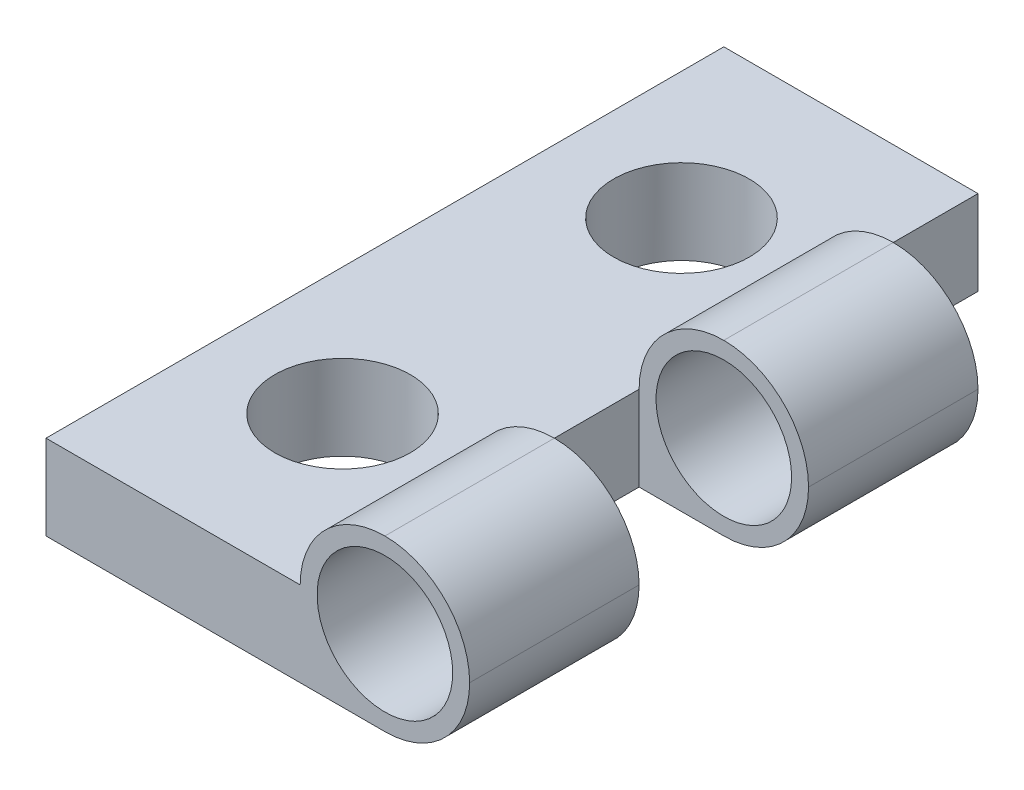
ISO-10303-21;
HEADER;
FILE_DESCRIPTION(('STEP AP214'),'2;1');
FILE_NAME('part.step','',(''),(''),'','','');
FILE_SCHEMA(('AUTOMOTIVE_DESIGN { 1 0 10303 214 1 1 1 1 }'));
ENDSEC;
DATA;
#1=APPLICATION_CONTEXT('core data for automotive mechanical design processes');
#2=APPLICATION_PROTOCOL_DEFINITION('international standard','automotive_design',2000,#1);
#3=PRODUCT_CONTEXT('',#1,'mechanical');
#4=PRODUCT('Part','Part','',(#3));
#5=PRODUCT_RELATED_PRODUCT_CATEGORY('part','',(#4));
#6=PRODUCT_DEFINITION_FORMATION('','',#4);
#7=PRODUCT_DEFINITION_CONTEXT('part definition',#1,'design');
#8=PRODUCT_DEFINITION('design','',#6,#7);
#9=PRODUCT_DEFINITION_SHAPE('','',#8);
#10=(LENGTH_UNIT() NAMED_UNIT(*) SI_UNIT(.MILLI.,.METRE.));
#11=(NAMED_UNIT(*) PLANE_ANGLE_UNIT() SI_UNIT($,.RADIAN.));
#12=(NAMED_UNIT(*) SI_UNIT($,.STERADIAN.) SOLID_ANGLE_UNIT());
#13=UNCERTAINTY_MEASURE_WITH_UNIT(LENGTH_MEASURE(1.E-05),#10,'distance_accuracy_value','');
#14=(GEOMETRIC_REPRESENTATION_CONTEXT(3) GLOBAL_UNCERTAINTY_ASSIGNED_CONTEXT((#13)) GLOBAL_UNIT_ASSIGNED_CONTEXT((#10,
#11,#12)) REPRESENTATION_CONTEXT('',''));
#15=CARTESIAN_POINT('',(0.,0.,0.));
#16=DIRECTION('',(0.,0.,1.));
#17=DIRECTION('',(1.,0.,0.));
#18=AXIS2_PLACEMENT_3D('',#15,#16,#17);
#19=CARTESIAN_POINT('',(7.5,5.,20.));
#20=DIRECTION('',(-1.,0.,0.));
#21=DIRECTION('',(0.,0.,1.));
#22=AXIS2_PLACEMENT_3D('',#19,#20,#21);
#23=PLANE('',#22);
#24=DIRECTION('',(0.,-1.,0.));
#25=VECTOR('',#24,1.);
#26=CARTESIAN_POINT('',(7.5,0.,0.));
#27=LINE('',#26,#25);
#28=CARTESIAN_POINT('',(7.5,5.,0.));
#29=VERTEX_POINT('',#28);
#30=CARTESIAN_POINT('',(7.5,0.,0.));
#31=VERTEX_POINT('',#30);
#32=EDGE_CURVE('E157',#29,#31,#27,.T.);
#33=ORIENTED_EDGE('',*,*,#32,.F.);
#34=DIRECTION('',(0.,0.,-1.));
#35=VECTOR('',#34,1.);
#36=CARTESIAN_POINT('',(7.5,5.,20.));
#37=LINE('',#36,#35);
#38=CARTESIAN_POINT('',(7.5,5.,10.));
#39=VERTEX_POINT('',#38);
#40=EDGE_CURVE('E181',#39,#29,#37,.T.);
#41=ORIENTED_EDGE('',*,*,#40,.F.);
#42=DIRECTION('',(0.,1.,0.));
#43=VECTOR('',#42,1.);
#44=CARTESIAN_POINT('',(7.5,0.,10.));
#45=LINE('',#44,#43);
#46=CARTESIAN_POINT('',(7.5,0.,10.));
#47=VERTEX_POINT('',#46);
#48=EDGE_CURVE('E170',#47,#39,#45,.T.);
#49=ORIENTED_EDGE('',*,*,#48,.F.);
#50=DIRECTION('',(0.,0.,-1.));
#51=VECTOR('',#50,1.);
#52=CARTESIAN_POINT('',(7.5,0.,20.));
#53=LINE('',#52,#51);
#54=EDGE_CURVE('E149',#47,#31,#53,.T.);
#55=ORIENTED_EDGE('',*,*,#54,.T.);
#56=EDGE_LOOP('',(#33,#41,#49,#55));
#57=FACE_BOUND('',#56,.T.);
#58=ADVANCED_FACE('F39',(#57),#23,.F.);
#59=DIRECTION('',(0.,1.,0.));
#60=VECTOR('',#59,1.);
#61=CARTESIAN_POINT('',(7.5,0.,-10.));
#62=LINE('',#61,#60);
#63=CARTESIAN_POINT('',(7.5,0.,-10.));
#64=VERTEX_POINT('',#63);
#65=CARTESIAN_POINT('',(7.5,5.,-10.));
#66=VERTEX_POINT('',#65);
#67=EDGE_CURVE('E133',#64,#66,#62,.T.);
#68=ORIENTED_EDGE('',*,*,#67,.F.);
#69=CARTESIAN_POINT('',(7.5,0.,-20.));
#70=VERTEX_POINT('',#69);
#71=EDGE_CURVE('E140',#64,#70,#53,.T.);
#72=ORIENTED_EDGE('',*,*,#71,.T.);
#73=DIRECTION('',(0.,-1.,0.));
#74=VECTOR('',#73,1.);
#75=CARTESIAN_POINT('',(7.5,5.,-20.));
#76=LINE('',#75,#74);
#77=CARTESIAN_POINT('',(7.5,5.,-20.));
#78=VERTEX_POINT('',#77);
#79=EDGE_CURVE('E210',#78,#70,#76,.T.);
#80=ORIENTED_EDGE('',*,*,#79,.F.);
#81=EDGE_CURVE('E154',#66,#78,#37,.T.);
#82=ORIENTED_EDGE('',*,*,#81,.F.);
#83=EDGE_LOOP('',(#68,#72,#80,#82));
#84=FACE_BOUND('',#83,.T.);
#85=ADVANCED_FACE('F153',(#84),#23,.F.);
#86=CARTESIAN_POINT('',(-7.5,5.,-20.));
#87=DIRECTION('',(0.,0.,1.));
#88=DIRECTION('',(1.,0.,0.));
#89=AXIS2_PLACEMENT_3D('',#86,#87,#88);
#90=PLANE('',#89);
#91=DIRECTION('',(-1.,0.,0.));
#92=VECTOR('',#91,1.);
#93=CARTESIAN_POINT('',(-7.5,0.,-20.));
#94=LINE('',#93,#92);
#95=CARTESIAN_POINT('',(-7.5,0.,-20.));
#96=VERTEX_POINT('',#95);
#97=EDGE_CURVE('E144',#70,#96,#94,.T.);
#98=ORIENTED_EDGE('',*,*,#97,.T.);
#99=DIRECTION('',(0.,-1.,0.));
#100=VECTOR('',#99,1.);
#101=CARTESIAN_POINT('',(-7.5,5.,-20.));
#102=LINE('',#101,#100);
#103=CARTESIAN_POINT('',(-7.5,5.,-20.));
#104=VERTEX_POINT('',#103);
#105=EDGE_CURVE('E206',#104,#96,#102,.T.);
#106=ORIENTED_EDGE('',*,*,#105,.F.);
#107=DIRECTION('',(-1.,0.,0.));
#108=VECTOR('',#107,1.);
#109=CARTESIAN_POINT('',(-7.5,5.,-20.));
#110=LINE('',#109,#108);
#111=EDGE_CURVE('E180',#78,#104,#110,.T.);
#112=ORIENTED_EDGE('',*,*,#111,.F.);
#113=ORIENTED_EDGE('',*,*,#79,.T.);
#114=EDGE_LOOP('',(#98,#106,#112,#113));
#115=FACE_BOUND('',#114,.T.);
#116=ADVANCED_FACE('F322',(#115),#90,.F.);
#117=CARTESIAN_POINT('',(-7.5,5.,20.));
#118=DIRECTION('',(1.,0.,0.));
#119=DIRECTION('',(0.,0.,-1.));
#120=AXIS2_PLACEMENT_3D('',#117,#118,#119);
#121=PLANE('',#120);
#122=DIRECTION('',(0.,0.,1.));
#123=VECTOR('',#122,1.);
#124=CARTESIAN_POINT('',(-7.5,0.,20.));
#125=LINE('',#124,#123);
#126=CARTESIAN_POINT('',(-7.5,0.,20.));
#127=VERTEX_POINT('',#126);
#128=EDGE_CURVE('E196',#96,#127,#125,.T.);
#129=ORIENTED_EDGE('',*,*,#128,.T.);
#130=DIRECTION('',(0.,-1.,0.));
#131=VECTOR('',#130,1.);
#132=CARTESIAN_POINT('',(-7.5,5.,20.));
#133=LINE('',#132,#131);
#134=CARTESIAN_POINT('',(-7.5,5.,20.));
#135=VERTEX_POINT('',#134);
#136=EDGE_CURVE('E190',#135,#127,#133,.T.);
#137=ORIENTED_EDGE('',*,*,#136,.F.);
#138=DIRECTION('',(0.,0.,1.));
#139=VECTOR('',#138,1.);
#140=CARTESIAN_POINT('',(-7.5,5.,20.));
#141=LINE('',#140,#139);
#142=EDGE_CURVE('E184',#104,#135,#141,.T.);
#143=ORIENTED_EDGE('',*,*,#142,.F.);
#144=ORIENTED_EDGE('',*,*,#105,.T.);
#145=EDGE_LOOP('',(#129,#137,#143,#144));
#146=FACE_BOUND('',#145,.T.);
#147=ADVANCED_FACE('F369',(#146),#121,.F.);
#148=CARTESIAN_POINT('',(-7.5,5.,20.));
#149=DIRECTION('',(0.,0.,-1.));
#150=DIRECTION('',(-1.,0.,0.));
#151=AXIS2_PLACEMENT_3D('',#148,#149,#150);
#152=PLANE('',#151);
#153=CARTESIAN_POINT('',(12.5,5.,20.));
#154=DIRECTION('',(0.,0.,1.));
#155=DIRECTION('',(1.,0.,0.));
#156=AXIS2_PLACEMENT_3D('',#153,#154,#155);
#157=CIRCLE('',#156,4.);
#158=CARTESIAN_POINT('',(16.5,5.,20.));
#159=VERTEX_POINT('',#158);
#160=EDGE_CURVE('E258',#159,#159,#157,.T.);
#161=ORIENTED_EDGE('',*,*,#160,.F.);
#162=EDGE_LOOP('',(#161));
#163=FACE_BOUND('',#162,.T.);
#164=CARTESIAN_POINT('',(12.5,5.,20.));
#165=DIRECTION('',(0.,0.,-1.));
#166=DIRECTION('',(-1.,0.,0.));
#167=AXIS2_PLACEMENT_3D('',#164,#165,#166);
#168=CIRCLE('',#167,5.);
#169=CARTESIAN_POINT('',(17.5,5.,20.));
#170=VERTEX_POINT('',#169);
#171=CARTESIAN_POINT('',(12.5,10.,20.));
#172=VERTEX_POINT('',#171);
#173=EDGE_CURVE('E213',#170,#172,#168,.F.);
#174=ORIENTED_EDGE('',*,*,#173,.T.);
#175=CARTESIAN_POINT('',(12.5,5.,20.));
#176=DIRECTION('',(0.,0.,-1.));
#177=DIRECTION('',(-1.,0.,0.));
#178=AXIS2_PLACEMENT_3D('',#175,#176,#177);
#179=CIRCLE('',#178,5.);
#180=CARTESIAN_POINT('',(7.5,5.,20.));
#181=VERTEX_POINT('',#180);
#182=EDGE_CURVE('E219',#172,#181,#179,.F.);
#183=ORIENTED_EDGE('',*,*,#182,.T.);
#184=DIRECTION('',(1.,0.,0.));
#185=VECTOR('',#184,1.);
#186=CARTESIAN_POINT('',(-7.5,5.,20.));
#187=LINE('',#186,#185);
#188=EDGE_CURVE('E187',#135,#181,#187,.T.);
#189=ORIENTED_EDGE('',*,*,#188,.F.);
#190=ORIENTED_EDGE('',*,*,#136,.T.);
#191=DIRECTION('',(1.,0.,0.));
#192=VECTOR('',#191,1.);
#193=CARTESIAN_POINT('',(-7.5,0.,20.));
#194=LINE('',#193,#192);
#195=CARTESIAN_POINT('',(12.5,0.,20.));
#196=VERTEX_POINT('',#195);
#197=EDGE_CURVE('E199',#127,#196,#194,.T.);
#198=ORIENTED_EDGE('',*,*,#197,.T.);
#199=CARTESIAN_POINT('',(12.5,5.,20.));
#200=DIRECTION('',(0.,0.,-1.));
#201=DIRECTION('',(-1.,0.,0.));
#202=AXIS2_PLACEMENT_3D('',#199,#200,#201);
#203=CIRCLE('',#202,5.);
#204=EDGE_CURVE('E216',#196,#170,#203,.F.);
#205=ORIENTED_EDGE('',*,*,#204,.T.);
#206=EDGE_LOOP('',(#174,#183,#189,#190,#198,#205));
#207=FACE_BOUND('',#206,.T.);
#208=ADVANCED_FACE('F381',(#163,#207),#152,.F.);
#209=CARTESIAN_POINT('',(0.,5.,0.));
#210=DIRECTION('',(0.,-1.,0.));
#211=DIRECTION('',(0.,0.,-1.));
#212=AXIS2_PLACEMENT_3D('',#209,#210,#211);
#213=PLANE('',#212);
#214=CARTESIAN_POINT('',(0.,5.,-10.));
#215=DIRECTION('',(0.,1.,0.));
#216=DIRECTION('',(0.,0.,1.));
#217=AXIS2_PLACEMENT_3D('',#214,#215,#216);
#218=CIRCLE('',#217,4.);
#219=CARTESIAN_POINT('',(0.,5.,-6.));
#220=VERTEX_POINT('',#219);
#221=EDGE_CURVE('E268',#220,#220,#218,.T.);
#222=ORIENTED_EDGE('',*,*,#221,.F.);
#223=EDGE_LOOP('',(#222));
#224=FACE_BOUND('',#223,.T.);
#225=CARTESIAN_POINT('',(0.,5.,10.));
#226=DIRECTION('',(0.,1.,0.));
#227=DIRECTION('',(0.,0.,1.));
#228=AXIS2_PLACEMENT_3D('',#225,#226,#227);
#229=CIRCLE('',#228,4.);
#230=CARTESIAN_POINT('',(0.,5.,14.));
#231=VERTEX_POINT('',#230);
#232=EDGE_CURVE('E275',#231,#231,#229,.T.);
#233=ORIENTED_EDGE('',*,*,#232,.F.);
#234=EDGE_LOOP('',(#233));
#235=FACE_BOUND('',#234,.T.);
#236=EDGE_CURVE('E176',#181,#39,#37,.T.);
#237=ORIENTED_EDGE('',*,*,#236,.T.);
#238=ORIENTED_EDGE('',*,*,#40,.T.);
#239=DIRECTION('',(0.,0.,-1.));
#240=VECTOR('',#239,1.);
#241=CARTESIAN_POINT('',(7.5,5.,0.));
#242=LINE('',#241,#240);
#243=EDGE_CURVE('E167',#29,#66,#242,.T.);
#244=ORIENTED_EDGE('',*,*,#243,.T.);
#245=ORIENTED_EDGE('',*,*,#81,.T.);
#246=ORIENTED_EDGE('',*,*,#111,.T.);
#247=ORIENTED_EDGE('',*,*,#142,.T.);
#248=ORIENTED_EDGE('',*,*,#188,.T.);
#249=EDGE_LOOP('',(#237,#238,#244,#245,#246,#247,#248));
#250=FACE_BOUND('',#249,.T.);
#251=ADVANCED_FACE('F359',(#224,#235,#250),#213,.F.);
#252=CARTESIAN_POINT('',(0.,0.,0.));
#253=DIRECTION('',(0.,-1.,0.));
#254=DIRECTION('',(0.,0.,-1.));
#255=AXIS2_PLACEMENT_3D('',#252,#253,#254);
#256=PLANE('',#255);
#257=CARTESIAN_POINT('',(0.,0.,-10.));
#258=DIRECTION('',(0.,-1.,0.));
#259=DIRECTION('',(0.,0.,-1.));
#260=AXIS2_PLACEMENT_3D('',#257,#258,#259);
#261=CIRCLE('',#260,4.);
#262=CARTESIAN_POINT('',(0.,0.,-14.));
#263=VERTEX_POINT('',#262);
#264=EDGE_CURVE('E43',#263,#263,#261,.T.);
#265=ORIENTED_EDGE('',*,*,#264,.F.);
#266=EDGE_LOOP('',(#265));
#267=FACE_BOUND('',#266,.T.);
#268=CARTESIAN_POINT('',(0.,0.,10.));
#269=DIRECTION('',(0.,-1.,0.));
#270=DIRECTION('',(0.,0.,-1.));
#271=AXIS2_PLACEMENT_3D('',#268,#269,#270);
#272=CIRCLE('',#271,4.);
#273=CARTESIAN_POINT('',(0.,0.,6.));
#274=VERTEX_POINT('',#273);
#275=EDGE_CURVE('E265',#274,#274,#272,.T.);
#276=ORIENTED_EDGE('',*,*,#275,.F.);
#277=EDGE_LOOP('',(#276));
#278=FACE_BOUND('',#277,.T.);
#279=DIRECTION('',(-1.,0.,0.));
#280=VECTOR('',#279,1.);
#281=CARTESIAN_POINT('',(17.5,0.,10.));
#282=LINE('',#281,#280);
#283=CARTESIAN_POINT('',(12.5,0.,10.));
#284=VERTEX_POINT('',#283);
#285=EDGE_CURVE('E150',#284,#47,#282,.T.);
#286=ORIENTED_EDGE('',*,*,#285,.F.);
#287=DIRECTION('',(0.,0.,-1.));
#288=VECTOR('',#287,1.);
#289=CARTESIAN_POINT('',(12.5,0.,20.));
#290=LINE('',#289,#288);
#291=EDGE_CURVE('E11',#284,#196,#290,.F.);
#292=ORIENTED_EDGE('',*,*,#291,.T.);
#293=ORIENTED_EDGE('',*,*,#197,.F.);
#294=ORIENTED_EDGE('',*,*,#128,.F.);
#295=ORIENTED_EDGE('',*,*,#97,.F.);
#296=ORIENTED_EDGE('',*,*,#71,.F.);
#297=DIRECTION('',(-1.,0.,0.));
#298=VECTOR('',#297,1.);
#299=CARTESIAN_POINT('',(17.5,0.,-10.));
#300=LINE('',#299,#298);
#301=CARTESIAN_POINT('',(12.5,0.,-10.));
#302=VERTEX_POINT('',#301);
#303=EDGE_CURVE('E129',#302,#64,#300,.T.);
#304=ORIENTED_EDGE('',*,*,#303,.F.);
#305=DIRECTION('',(0.,0.,-1.));
#306=VECTOR('',#305,1.);
#307=CARTESIAN_POINT('',(12.5,0.,0.));
#308=LINE('',#307,#306);
#309=CARTESIAN_POINT('',(12.5,0.,0.));
#310=VERTEX_POINT('',#309);
#311=EDGE_CURVE('E49',#302,#310,#308,.F.);
#312=ORIENTED_EDGE('',*,*,#311,.T.);
#313=DIRECTION('',(-1.,0.,0.));
#314=VECTOR('',#313,1.);
#315=CARTESIAN_POINT('',(17.5,0.,0.));
#316=LINE('',#315,#314);
#317=EDGE_CURVE('E137',#310,#31,#316,.T.);
#318=ORIENTED_EDGE('',*,*,#317,.T.);
#319=ORIENTED_EDGE('',*,*,#54,.F.);
#320=EDGE_LOOP('',(#286,#292,#293,#294,#295,#296,#304,#312,#318,#319));
#321=FACE_BOUND('',#320,.T.);
#322=ADVANCED_FACE('F142',(#267,#278,#321),#256,.T.);
#323=CARTESIAN_POINT('',(17.5,0.,10.));
#324=DIRECTION('',(0.,0.,1.));
#325=DIRECTION('',(1.,0.,0.));
#326=AXIS2_PLACEMENT_3D('',#323,#324,#325);
#327=PLANE('',#326);
#328=CARTESIAN_POINT('',(12.5,5.,10.));
#329=DIRECTION('',(0.,0.,1.));
#330=DIRECTION('',(1.,0.,0.));
#331=AXIS2_PLACEMENT_3D('',#328,#329,#330);
#332=CIRCLE('',#331,4.);
#333=CARTESIAN_POINT('',(16.5,5.,10.));
#334=VERTEX_POINT('',#333);
#335=EDGE_CURVE('E161',#334,#334,#332,.T.);
#336=ORIENTED_EDGE('',*,*,#335,.T.);
#337=EDGE_LOOP('',(#336));
#338=FACE_BOUND('',#337,.T.);
#339=ORIENTED_EDGE('',*,*,#48,.T.);
#340=CARTESIAN_POINT('',(12.5,5.,10.));
#341=DIRECTION('',(0.,0.,1.));
#342=DIRECTION('',(1.,0.,0.));
#343=AXIS2_PLACEMENT_3D('',#340,#341,#342);
#344=CIRCLE('',#343,5.);
#345=CARTESIAN_POINT('',(12.5,10.,10.));
#346=VERTEX_POINT('',#345);
#347=EDGE_CURVE('E228',#39,#346,#344,.F.);
#348=ORIENTED_EDGE('',*,*,#347,.T.);
#349=CARTESIAN_POINT('',(12.5,5.,10.));
#350=DIRECTION('',(0.,0.,1.));
#351=DIRECTION('',(1.,0.,0.));
#352=AXIS2_PLACEMENT_3D('',#349,#350,#351);
#353=CIRCLE('',#352,5.);
#354=CARTESIAN_POINT('',(17.5,5.,10.));
#355=VERTEX_POINT('',#354);
#356=EDGE_CURVE('E222',#346,#355,#353,.F.);
#357=ORIENTED_EDGE('',*,*,#356,.T.);
#358=CARTESIAN_POINT('',(12.5,5.,10.));
#359=DIRECTION('',(0.,0.,1.));
#360=DIRECTION('',(1.,0.,0.));
#361=AXIS2_PLACEMENT_3D('',#358,#359,#360);
#362=CIRCLE('',#361,5.);
#363=EDGE_CURVE('E225',#355,#284,#362,.F.);
#364=ORIENTED_EDGE('',*,*,#363,.T.);
#365=ORIENTED_EDGE('',*,*,#285,.T.);
#366=EDGE_LOOP('',(#339,#348,#357,#364,#365));
#367=FACE_BOUND('',#366,.T.);
#368=ADVANCED_FACE('F297',(#338,#367),#327,.F.);
#369=CARTESIAN_POINT('',(17.5,0.,0.));
#370=DIRECTION('',(0.,0.,-1.));
#371=DIRECTION('',(0.,1.,0.));
#372=AXIS2_PLACEMENT_3D('',#369,#370,#371);
#373=PLANE('',#372);
#374=CARTESIAN_POINT('',(12.5,5.,0.));
#375=DIRECTION('',(0.,0.,-1.));
#376=DIRECTION('',(0.,1.,0.));
#377=AXIS2_PLACEMENT_3D('',#374,#375,#376);
#378=CIRCLE('',#377,4.);
#379=CARTESIAN_POINT('',(12.5,9.,0.));
#380=VERTEX_POINT('',#379);
#381=EDGE_CURVE('E287',#380,#380,#378,.T.);
#382=ORIENTED_EDGE('',*,*,#381,.T.);
#383=EDGE_LOOP('',(#382));
#384=FACE_BOUND('',#383,.T.);
#385=CARTESIAN_POINT('',(12.5,5.,0.));
#386=DIRECTION('',(0.,0.,-1.));
#387=DIRECTION('',(0.,1.,0.));
#388=AXIS2_PLACEMENT_3D('',#385,#386,#387);
#389=CIRCLE('',#388,5.);
#390=CARTESIAN_POINT('',(17.5,5.,0.));
#391=VERTEX_POINT('',#390);
#392=CARTESIAN_POINT('',(12.5,10.,0.));
#393=VERTEX_POINT('',#392);
#394=EDGE_CURVE('E231',#391,#393,#389,.F.);
#395=ORIENTED_EDGE('',*,*,#394,.T.);
#396=CARTESIAN_POINT('',(12.5,5.,0.));
#397=DIRECTION('',(0.,0.,-1.));
#398=DIRECTION('',(0.,1.,0.));
#399=AXIS2_PLACEMENT_3D('',#396,#397,#398);
#400=CIRCLE('',#399,5.);
#401=EDGE_CURVE('E237',#393,#29,#400,.F.);
#402=ORIENTED_EDGE('',*,*,#401,.T.);
#403=ORIENTED_EDGE('',*,*,#32,.T.);
#404=ORIENTED_EDGE('',*,*,#317,.F.);
#405=CARTESIAN_POINT('',(12.5,5.,0.));
#406=DIRECTION('',(0.,0.,-1.));
#407=DIRECTION('',(0.,1.,0.));
#408=AXIS2_PLACEMENT_3D('',#405,#406,#407);
#409=CIRCLE('',#408,5.);
#410=EDGE_CURVE('E234',#310,#391,#409,.F.);
#411=ORIENTED_EDGE('',*,*,#410,.T.);
#412=EDGE_LOOP('',(#395,#402,#403,#404,#411));
#413=FACE_BOUND('',#412,.T.);
#414=ADVANCED_FACE('F352',(#384,#413),#373,.F.);
#415=CARTESIAN_POINT('',(17.5,0.,-10.));
#416=DIRECTION('',(0.,0.,1.));
#417=DIRECTION('',(0.,-1.,0.));
#418=AXIS2_PLACEMENT_3D('',#415,#416,#417);
#419=PLANE('',#418);
#420=CARTESIAN_POINT('',(12.5,5.,-9.99999999999999));
#421=DIRECTION('',(0.,0.,1.));
#422=DIRECTION('',(1.,0.,0.));
#423=AXIS2_PLACEMENT_3D('',#420,#421,#422);
#424=CIRCLE('',#423,4.);
#425=CARTESIAN_POINT('',(16.5,5.,-9.99999999999999));
#426=VERTEX_POINT('',#425);
#427=EDGE_CURVE('E283',#426,#426,#424,.T.);
#428=ORIENTED_EDGE('',*,*,#427,.T.);
#429=EDGE_LOOP('',(#428));
#430=FACE_BOUND('',#429,.T.);
#431=ORIENTED_EDGE('',*,*,#67,.T.);
#432=CARTESIAN_POINT('',(12.5,5.,-10.));
#433=DIRECTION('',(0.,0.,1.));
#434=DIRECTION('',(0.,-1.,0.));
#435=AXIS2_PLACEMENT_3D('',#432,#433,#434);
#436=CIRCLE('',#435,5.);
#437=CARTESIAN_POINT('',(12.5,10.,-10.));
#438=VERTEX_POINT('',#437);
#439=EDGE_CURVE('E244',#66,#438,#436,.F.);
#440=ORIENTED_EDGE('',*,*,#439,.T.);
#441=CARTESIAN_POINT('',(12.5,5.,-10.));
#442=DIRECTION('',(0.,0.,1.));
#443=DIRECTION('',(0.,-1.,0.));
#444=AXIS2_PLACEMENT_3D('',#441,#442,#443);
#445=CIRCLE('',#444,5.);
#446=CARTESIAN_POINT('',(17.5,5.,-10.));
#447=VERTEX_POINT('',#446);
#448=EDGE_CURVE('E62',#438,#447,#445,.F.);
#449=ORIENTED_EDGE('',*,*,#448,.T.);
#450=CARTESIAN_POINT('',(12.5,5.,-10.));
#451=DIRECTION('',(0.,0.,1.));
#452=DIRECTION('',(0.,-1.,0.));
#453=AXIS2_PLACEMENT_3D('',#450,#451,#452);
#454=CIRCLE('',#453,5.);
#455=EDGE_CURVE('E57',#447,#302,#454,.F.);
#456=ORIENTED_EDGE('',*,*,#455,.T.);
#457=ORIENTED_EDGE('',*,*,#303,.T.);
#458=EDGE_LOOP('',(#431,#440,#449,#456,#457));
#459=FACE_BOUND('',#458,.T.);
#460=ADVANCED_FACE('F131',(#430,#459),#419,.F.);
#461=CARTESIAN_POINT('',(12.5,5.,-9.99999999999999));
#462=DIRECTION('',(0.,0.,1.));
#463=DIRECTION('',(1.,0.,0.));
#464=AXIS2_PLACEMENT_3D('',#461,#462,#463);
#465=CYLINDRICAL_SURFACE('',#464,4.);
#466=ORIENTED_EDGE('',*,*,#427,.F.);
#467=EDGE_LOOP('',(#466));
#468=FACE_BOUND('',#467,.T.);
#469=ORIENTED_EDGE('',*,*,#381,.F.);
#470=EDGE_LOOP('',(#469));
#471=FACE_BOUND('',#470,.T.);
#472=ADVANCED_FACE('F303',(#468,#471),#465,.F.);
#473=ORIENTED_EDGE('',*,*,#160,.T.);
#474=EDGE_LOOP('',(#473));
#475=FACE_BOUND('',#474,.T.);
#476=ORIENTED_EDGE('',*,*,#335,.F.);
#477=EDGE_LOOP('',(#476));
#478=FACE_BOUND('',#477,.T.);
#479=ADVANCED_FACE('F300',(#475,#478),#465,.F.);
#480=CARTESIAN_POINT('',(12.5,5.,0.));
#481=DIRECTION('',(0.,0.,1.));
#482=DIRECTION('',(1.,0.,0.));
#483=AXIS2_PLACEMENT_3D('',#480,#481,#482);
#484=CYLINDRICAL_SURFACE('',#483,5.);
#485=ORIENTED_EDGE('',*,*,#291,.F.);
#486=ORIENTED_EDGE('',*,*,#363,.F.);
#487=DIRECTION('',(0.,0.,-1.));
#488=VECTOR('',#487,1.);
#489=CARTESIAN_POINT('',(17.5,5.,10.));
#490=LINE('',#489,#488);
#491=EDGE_CURVE('E253',#170,#355,#490,.T.);
#492=ORIENTED_EDGE('',*,*,#491,.F.);
#493=ORIENTED_EDGE('',*,*,#204,.F.);
#494=EDGE_LOOP('',(#485,#486,#492,#493));
#495=FACE_BOUND('',#494,.T.);
#496=ADVANCED_FACE('F302',(#495),#484,.T.);
#497=CARTESIAN_POINT('',(12.5,5.,0.));
#498=DIRECTION('',(0.,0.,1.));
#499=DIRECTION('',(1.,0.,0.));
#500=AXIS2_PLACEMENT_3D('',#497,#498,#499);
#501=CYLINDRICAL_SURFACE('',#500,5.);
#502=ORIENTED_EDGE('',*,*,#491,.T.);
#503=ORIENTED_EDGE('',*,*,#356,.F.);
#504=DIRECTION('',(0.,0.,1.));
#505=VECTOR('',#504,1.);
#506=CARTESIAN_POINT('',(12.5,10.,20.));
#507=LINE('',#506,#505);
#508=EDGE_CURVE('E249',#172,#346,#507,.F.);
#509=ORIENTED_EDGE('',*,*,#508,.F.);
#510=ORIENTED_EDGE('',*,*,#173,.F.);
#511=EDGE_LOOP('',(#502,#503,#509,#510));
#512=FACE_BOUND('',#511,.T.);
#513=ADVANCED_FACE('F310',(#512),#501,.T.);
#514=CARTESIAN_POINT('',(12.5,5.,20.));
#515=DIRECTION('',(0.,0.,-1.));
#516=DIRECTION('',(-1.,0.,0.));
#517=AXIS2_PLACEMENT_3D('',#514,#515,#516);
#518=CYLINDRICAL_SURFACE('',#517,5.);
#519=ORIENTED_EDGE('',*,*,#347,.F.);
#520=ORIENTED_EDGE('',*,*,#236,.F.);
#521=ORIENTED_EDGE('',*,*,#182,.F.);
#522=ORIENTED_EDGE('',*,*,#508,.T.);
#523=EDGE_LOOP('',(#519,#520,#521,#522));
#524=FACE_BOUND('',#523,.T.);
#525=ADVANCED_FACE('F327',(#524),#518,.T.);
#526=CARTESIAN_POINT('',(12.5,5.,0.));
#527=DIRECTION('',(0.,0.,1.));
#528=DIRECTION('',(1.,0.,0.));
#529=AXIS2_PLACEMENT_3D('',#526,#527,#528);
#530=CYLINDRICAL_SURFACE('',#529,5.);
#531=ORIENTED_EDGE('',*,*,#311,.F.);
#532=ORIENTED_EDGE('',*,*,#455,.F.);
#533=DIRECTION('',(0.,0.,-1.));
#534=VECTOR('',#533,1.);
#535=CARTESIAN_POINT('',(17.5,5.,-10.));
#536=LINE('',#535,#534);
#537=EDGE_CURVE('E254',#391,#447,#536,.T.);
#538=ORIENTED_EDGE('',*,*,#537,.F.);
#539=ORIENTED_EDGE('',*,*,#410,.F.);
#540=EDGE_LOOP('',(#531,#532,#538,#539));
#541=FACE_BOUND('',#540,.T.);
#542=ADVANCED_FACE('F41',(#541),#530,.T.);
#543=CARTESIAN_POINT('',(12.5,5.,0.));
#544=DIRECTION('',(0.,0.,1.));
#545=DIRECTION('',(0.,-1.,0.));
#546=AXIS2_PLACEMENT_3D('',#543,#544,#545);
#547=CYLINDRICAL_SURFACE('',#546,5.);
#548=ORIENTED_EDGE('',*,*,#537,.T.);
#549=ORIENTED_EDGE('',*,*,#448,.F.);
#550=DIRECTION('',(0.,0.,1.));
#551=VECTOR('',#550,1.);
#552=CARTESIAN_POINT('',(12.5,10.,0.));
#553=LINE('',#552,#551);
#554=EDGE_CURVE('E259',#393,#438,#553,.F.);
#555=ORIENTED_EDGE('',*,*,#554,.F.);
#556=ORIENTED_EDGE('',*,*,#394,.F.);
#557=EDGE_LOOP('',(#548,#549,#555,#556));
#558=FACE_BOUND('',#557,.T.);
#559=ADVANCED_FACE('F337',(#558),#547,.T.);
#560=CARTESIAN_POINT('',(12.5,5.,0.));
#561=DIRECTION('',(0.,0.,-1.));
#562=DIRECTION('',(0.,1.,0.));
#563=AXIS2_PLACEMENT_3D('',#560,#561,#562);
#564=CYLINDRICAL_SURFACE('',#563,5.);
#565=ORIENTED_EDGE('',*,*,#439,.F.);
#566=ORIENTED_EDGE('',*,*,#243,.F.);
#567=ORIENTED_EDGE('',*,*,#401,.F.);
#568=ORIENTED_EDGE('',*,*,#554,.T.);
#569=EDGE_LOOP('',(#565,#566,#567,#568));
#570=FACE_BOUND('',#569,.T.);
#571=ADVANCED_FACE('F334',(#570),#564,.T.);
#572=CARTESIAN_POINT('',(0.,-25.,10.));
#573=DIRECTION('',(0.,1.,0.));
#574=DIRECTION('',(0.,0.,1.));
#575=AXIS2_PLACEMENT_3D('',#572,#573,#574);
#576=CYLINDRICAL_SURFACE('',#575,4.);
#577=ORIENTED_EDGE('',*,*,#275,.T.);
#578=EDGE_LOOP('',(#577));
#579=FACE_BOUND('',#578,.T.);
#580=ORIENTED_EDGE('',*,*,#232,.T.);
#581=EDGE_LOOP('',(#580));
#582=FACE_BOUND('',#581,.T.);
#583=ADVANCED_FACE('F336',(#579,#582),#576,.F.);
#584=CARTESIAN_POINT('',(0.,-25.,-10.));
#585=DIRECTION('',(0.,1.,0.));
#586=DIRECTION('',(0.,0.,1.));
#587=AXIS2_PLACEMENT_3D('',#584,#585,#586);
#588=CYLINDRICAL_SURFACE('',#587,4.);
#589=ORIENTED_EDGE('',*,*,#264,.T.);
#590=EDGE_LOOP('',(#589));
#591=FACE_BOUND('',#590,.T.);
#592=ORIENTED_EDGE('',*,*,#221,.T.);
#593=EDGE_LOOP('',(#592));
#594=FACE_BOUND('',#593,.T.);
#595=ADVANCED_FACE('F504',(#591,#594),#588,.F.);
#596=CLOSED_SHELL('',(#58,#85,#116,#147,#208,#251,#322,#368,#414,#460,#472,#479,#496,#513,#525,
#542,#559,#571,#583,#595));
#597=MANIFOLD_SOLID_BREP('B2',#596);
#598=ADVANCED_BREP_SHAPE_REPRESENTATION('',(#18,#597),#14);
#599=SHAPE_DEFINITION_REPRESENTATION(#9,#598);
ENDSEC;
END-ISO-10303-21;
